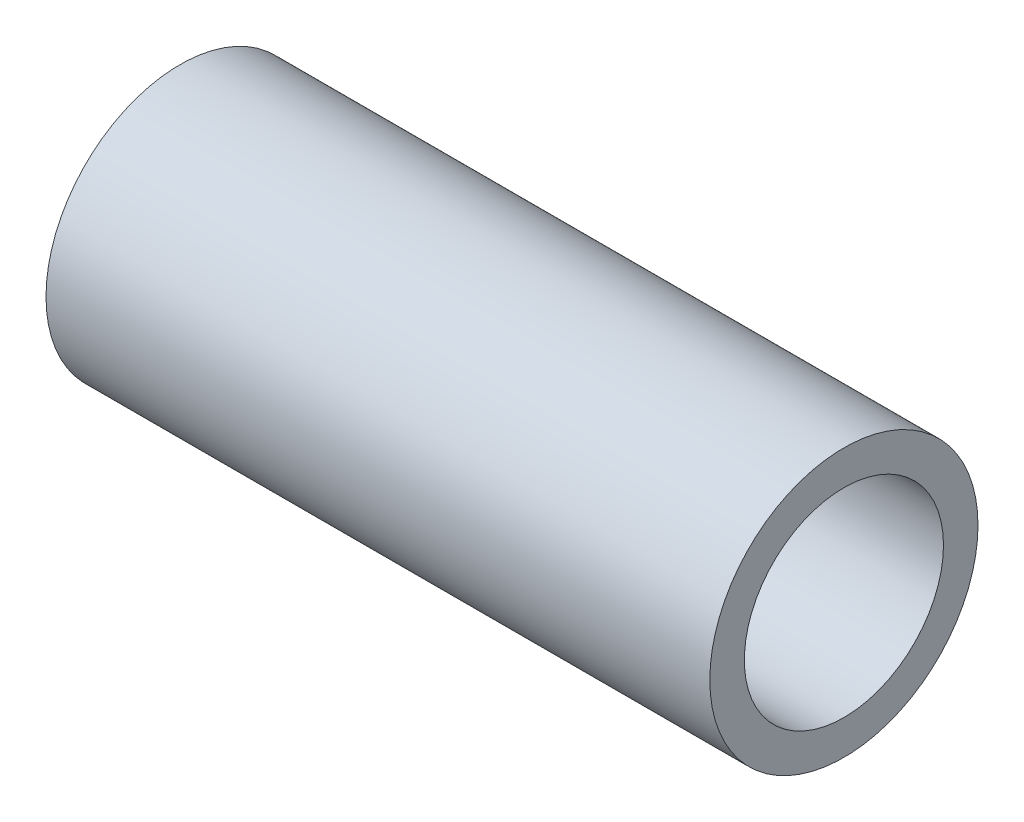
ISO-10303-21;
HEADER;
FILE_DESCRIPTION(('STEP AP214'),'2;1');
FILE_NAME('part.step','',(''),(''),'','','');
FILE_SCHEMA(('AUTOMOTIVE_DESIGN { 1 0 10303 214 1 1 1 1 }'));
ENDSEC;
DATA;
#1=APPLICATION_CONTEXT('core data for automotive mechanical design processes');
#2=APPLICATION_PROTOCOL_DEFINITION('international standard','automotive_design',2000,#1);
#3=PRODUCT_CONTEXT('',#1,'mechanical');
#4=PRODUCT('Part','Part','',(#3));
#5=PRODUCT_RELATED_PRODUCT_CATEGORY('part','',(#4));
#6=PRODUCT_DEFINITION_FORMATION('','',#4);
#7=PRODUCT_DEFINITION_CONTEXT('part definition',#1,'design');
#8=PRODUCT_DEFINITION('design','',#6,#7);
#9=PRODUCT_DEFINITION_SHAPE('','',#8);
#10=(LENGTH_UNIT() NAMED_UNIT(*) SI_UNIT(.MILLI.,.METRE.));
#11=(NAMED_UNIT(*) PLANE_ANGLE_UNIT() SI_UNIT($,.RADIAN.));
#12=(NAMED_UNIT(*) SI_UNIT($,.STERADIAN.) SOLID_ANGLE_UNIT());
#13=UNCERTAINTY_MEASURE_WITH_UNIT(LENGTH_MEASURE(1.E-05),#10,'distance_accuracy_value','');
#14=(GEOMETRIC_REPRESENTATION_CONTEXT(3) GLOBAL_UNCERTAINTY_ASSIGNED_CONTEXT((#13)) GLOBAL_UNIT_ASSIGNED_CONTEXT((#10,
#11,#12)) REPRESENTATION_CONTEXT('',''));
#15=CARTESIAN_POINT('',(0.,0.,0.));
#16=DIRECTION('',(0.,0.,1.));
#17=DIRECTION('',(1.,0.,0.));
#18=AXIS2_PLACEMENT_3D('',#15,#16,#17);
#19=CARTESIAN_POINT('',(50.,0.,0.));
#20=DIRECTION('',(1.,0.,0.));
#21=DIRECTION('',(0.,0.,-1.));
#22=AXIS2_PLACEMENT_3D('',#19,#20,#21);
#23=PLANE('',#22);
#24=CARTESIAN_POINT('',(50.,0.,0.));
#25=DIRECTION('',(1.,0.,0.));
#26=DIRECTION('',(0.,0.,-1.));
#27=AXIS2_PLACEMENT_3D('',#24,#25,#26);
#28=CIRCLE('',#27,10.1);
#29=CARTESIAN_POINT('',(50.,0.,-10.1));
#30=VERTEX_POINT('',#29);
#31=EDGE_CURVE('E10',#30,#30,#28,.T.);
#32=ORIENTED_EDGE('',*,*,#31,.T.);
#33=EDGE_LOOP('',(#32));
#34=FACE_BOUND('',#33,.T.);
#35=CARTESIAN_POINT('',(50.,0.,0.));
#36=DIRECTION('',(1.,0.,0.));
#37=DIRECTION('',(0.,0.,-1.));
#38=AXIS2_PLACEMENT_3D('',#35,#36,#37);
#39=CIRCLE('',#38,7.5);
#40=CARTESIAN_POINT('',(50.,0.,-7.5));
#41=VERTEX_POINT('',#40);
#42=EDGE_CURVE('E46',#41,#41,#39,.T.);
#43=ORIENTED_EDGE('',*,*,#42,.F.);
#44=EDGE_LOOP('',(#43));
#45=FACE_BOUND('',#44,.T.);
#46=ADVANCED_FACE('F35',(#34,#45),#23,.T.);
#47=CARTESIAN_POINT('',(0.,0.,0.));
#48=DIRECTION('',(1.,0.,0.));
#49=DIRECTION('',(0.,0.,-1.));
#50=AXIS2_PLACEMENT_3D('',#47,#48,#49);
#51=PLANE('',#50);
#52=CARTESIAN_POINT('',(0.,0.,0.));
#53=DIRECTION('',(1.,0.,0.));
#54=DIRECTION('',(0.,0.,-1.));
#55=AXIS2_PLACEMENT_3D('',#52,#53,#54);
#56=CIRCLE('',#55,10.1);
#57=CARTESIAN_POINT('',(0.,0.,-10.1));
#58=VERTEX_POINT('',#57);
#59=EDGE_CURVE('E39',#58,#58,#56,.T.);
#60=ORIENTED_EDGE('',*,*,#59,.F.);
#61=EDGE_LOOP('',(#60));
#62=FACE_BOUND('',#61,.T.);
#63=CARTESIAN_POINT('',(0.,0.,0.));
#64=DIRECTION('',(1.,0.,0.));
#65=DIRECTION('',(0.,0.,-1.));
#66=AXIS2_PLACEMENT_3D('',#63,#64,#65);
#67=CIRCLE('',#66,7.5);
#68=CARTESIAN_POINT('',(0.,0.,-7.5));
#69=VERTEX_POINT('',#68);
#70=EDGE_CURVE('E48',#69,#69,#67,.T.);
#71=ORIENTED_EDGE('',*,*,#70,.T.);
#72=EDGE_LOOP('',(#71));
#73=FACE_BOUND('',#72,.T.);
#74=ADVANCED_FACE('F58',(#62,#73),#51,.F.);
#75=CARTESIAN_POINT('',(50.,0.,0.));
#76=DIRECTION('',(-1.,0.,0.));
#77=DIRECTION('',(0.,0.,1.));
#78=AXIS2_PLACEMENT_3D('',#75,#76,#77);
#79=CYLINDRICAL_SURFACE('',#78,10.1);
#80=ORIENTED_EDGE('',*,*,#31,.F.);
#81=EDGE_LOOP('',(#80));
#82=FACE_BOUND('',#81,.T.);
#83=ORIENTED_EDGE('',*,*,#59,.T.);
#84=EDGE_LOOP('',(#83));
#85=FACE_BOUND('',#84,.T.);
#86=ADVANCED_FACE('F37',(#82,#85),#79,.T.);
#87=CARTESIAN_POINT('',(50.,0.,0.));
#88=DIRECTION('',(-1.,0.,0.));
#89=DIRECTION('',(0.,0.,1.));
#90=AXIS2_PLACEMENT_3D('',#87,#88,#89);
#91=CYLINDRICAL_SURFACE('',#90,7.5);
#92=ORIENTED_EDGE('',*,*,#42,.T.);
#93=EDGE_LOOP('',(#92));
#94=FACE_BOUND('',#93,.T.);
#95=ORIENTED_EDGE('',*,*,#70,.F.);
#96=EDGE_LOOP('',(#95));
#97=FACE_BOUND('',#96,.T.);
#98=ADVANCED_FACE('F54',(#94,#97),#91,.F.);
#99=CLOSED_SHELL('',(#46,#74,#86,#98));
#100=MANIFOLD_SOLID_BREP('B2',#99);
#101=ADVANCED_BREP_SHAPE_REPRESENTATION('',(#18,#100),#14);
#102=SHAPE_DEFINITION_REPRESENTATION(#9,#101);
ENDSEC;
END-ISO-10303-21;
